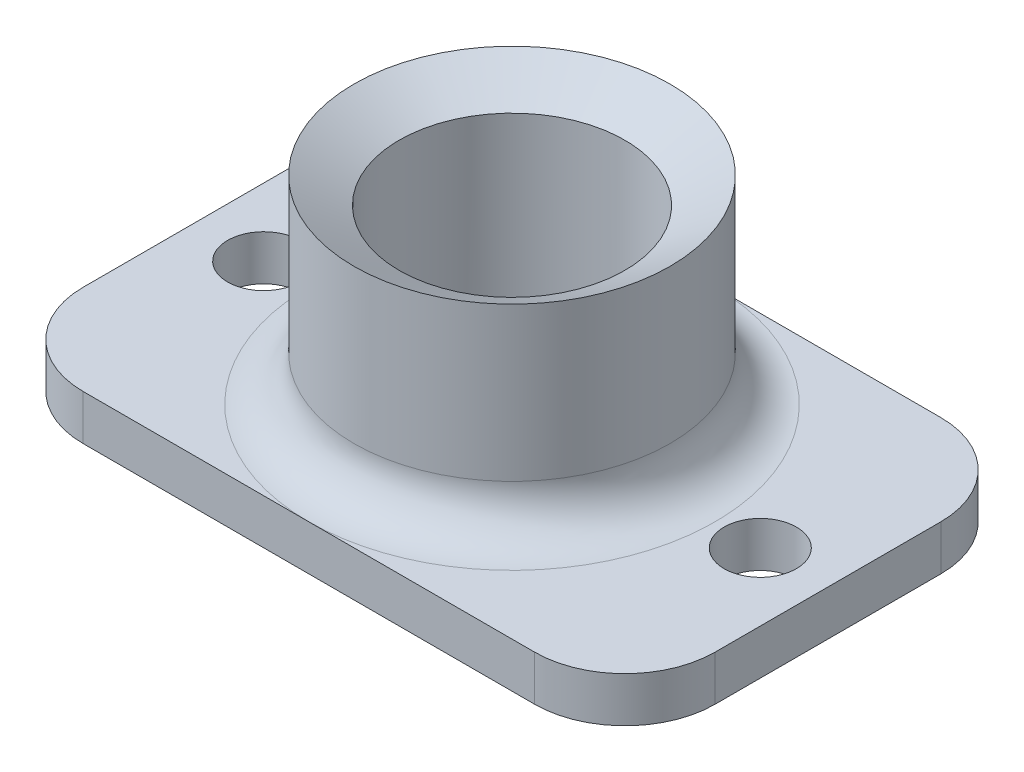
ISO-10303-21;
HEADER;
FILE_DESCRIPTION(('STEP AP214'),'2;1');
FILE_NAME('part.step','',(''),(''),'','','');
FILE_SCHEMA(('AUTOMOTIVE_DESIGN { 1 0 10303 214 1 1 1 1 }'));
ENDSEC;
DATA;
#1=APPLICATION_CONTEXT('core data for automotive mechanical design processes');
#2=APPLICATION_PROTOCOL_DEFINITION('international standard','automotive_design',2000,#1);
#3=PRODUCT_CONTEXT('',#1,'mechanical');
#4=PRODUCT('Part','Part','',(#3));
#5=PRODUCT_RELATED_PRODUCT_CATEGORY('part','',(#4));
#6=PRODUCT_DEFINITION_FORMATION('','',#4);
#7=PRODUCT_DEFINITION_CONTEXT('part definition',#1,'design');
#8=PRODUCT_DEFINITION('design','',#6,#7);
#9=PRODUCT_DEFINITION_SHAPE('','',#8);
#10=(LENGTH_UNIT() NAMED_UNIT(*) SI_UNIT(.MILLI.,.METRE.));
#11=(NAMED_UNIT(*) PLANE_ANGLE_UNIT() SI_UNIT($,.RADIAN.));
#12=(NAMED_UNIT(*) SI_UNIT($,.STERADIAN.) SOLID_ANGLE_UNIT());
#13=UNCERTAINTY_MEASURE_WITH_UNIT(LENGTH_MEASURE(1.E-05),#10,'distance_accuracy_value','');
#14=(GEOMETRIC_REPRESENTATION_CONTEXT(3) GLOBAL_UNCERTAINTY_ASSIGNED_CONTEXT((#13)) GLOBAL_UNIT_ASSIGNED_CONTEXT((#10,
#11,#12)) REPRESENTATION_CONTEXT('',''));
#15=CARTESIAN_POINT('',(0.,0.,0.));
#16=DIRECTION('',(0.,0.,1.));
#17=DIRECTION('',(1.,0.,0.));
#18=AXIS2_PLACEMENT_3D('',#15,#16,#17);
#19=CARTESIAN_POINT('',(0.,0.,0.));
#20=DIRECTION('',(0.,1.,0.));
#21=DIRECTION('',(0.,0.,1.));
#22=AXIS2_PLACEMENT_3D('',#19,#20,#21);
#23=CYLINDRICAL_SURFACE('',#22,12.5);
#24=CARTESIAN_POINT('',(0.,24.1132486540519,0.));
#25=DIRECTION('',(0.,1.,0.));
#26=DIRECTION('',(0.,0.,1.));
#27=AXIS2_PLACEMENT_3D('',#24,#25,#26);
#28=CIRCLE('',#27,12.5);
#29=CARTESIAN_POINT('',(0.,24.1132486540519,12.5));
#30=VERTEX_POINT('',#29);
#31=EDGE_CURVE('E11',#30,#30,#28,.T.);
#32=ORIENTED_EDGE('',*,*,#31,.T.);
#33=EDGE_LOOP('',(#32));
#34=FACE_BOUND('',#33,.T.);
#35=CARTESIAN_POINT('',(0.,2.,0.));
#36=DIRECTION('',(0.,-1.,0.));
#37=DIRECTION('',(0.,0.,-1.));
#38=AXIS2_PLACEMENT_3D('',#35,#36,#37);
#39=CIRCLE('',#38,12.5);
#40=CARTESIAN_POINT('',(0.,2.,-12.5));
#41=VERTEX_POINT('',#40);
#42=EDGE_CURVE('E48',#41,#41,#39,.F.);
#43=ORIENTED_EDGE('',*,*,#42,.F.);
#44=EDGE_LOOP('',(#43));
#45=FACE_BOUND('',#44,.T.);
#46=ADVANCED_FACE('F43',(#34,#45),#23,.F.);
#47=CARTESIAN_POINT('',(0.,5.,0.));
#48=DIRECTION('',(0.,-1.,0.));
#49=DIRECTION('',(0.,0.,-1.));
#50=AXIS2_PLACEMENT_3D('',#47,#48,#49);
#51=PLANE('',#50);
#52=CARTESIAN_POINT('',(-27.5,5.,0.));
#53=DIRECTION('',(0.,1.,0.));
#54=DIRECTION('',(0.,0.,1.));
#55=AXIS2_PLACEMENT_3D('',#52,#53,#54);
#56=CIRCLE('',#55,4.);
#57=CARTESIAN_POINT('',(-27.5,5.,4.));
#58=VERTEX_POINT('',#57);
#59=EDGE_CURVE('E256',#58,#58,#56,.T.);
#60=ORIENTED_EDGE('',*,*,#59,.F.);
#61=EDGE_LOOP('',(#60));
#62=FACE_BOUND('',#61,.T.);
#63=DIRECTION('',(1.,0.,0.));
#64=VECTOR('',#63,1.);
#65=CARTESIAN_POINT('',(-35.,5.,22.5));
#66=LINE('',#65,#64);
#67=CARTESIAN_POINT('',(-25.,5.,22.5));
#68=VERTEX_POINT('',#67);
#69=CARTESIAN_POINT('',(0.,5.,22.5));
#70=VERTEX_POINT('',#69);
#71=EDGE_CURVE('E138',#68,#70,#66,.T.);
#72=ORIENTED_EDGE('',*,*,#71,.T.);
#73=CARTESIAN_POINT('',(0.,5.,0.));
#74=DIRECTION('',(0.,-1.,0.));
#75=DIRECTION('',(0.,0.,-1.));
#76=AXIS2_PLACEMENT_3D('',#73,#74,#75);
#77=CIRCLE('',#76,22.5);
#78=CARTESIAN_POINT('',(0.,5.,-22.5));
#79=VERTEX_POINT('',#78);
#80=EDGE_CURVE('E54',#70,#79,#77,.T.);
#81=ORIENTED_EDGE('',*,*,#80,.T.);
#82=DIRECTION('',(-1.,0.,0.));
#83=VECTOR('',#82,1.);
#84=CARTESIAN_POINT('',(-35.,5.,-22.5));
#85=LINE('',#84,#83);
#86=CARTESIAN_POINT('',(-25.,5.,-22.5));
#87=VERTEX_POINT('',#86);
#88=EDGE_CURVE('E218',#79,#87,#85,.T.);
#89=ORIENTED_EDGE('',*,*,#88,.T.);
#90=CARTESIAN_POINT('',(-25.,5.,-12.5));
#91=DIRECTION('',(0.,-1.,0.));
#92=DIRECTION('',(0.,0.,-1.));
#93=AXIS2_PLACEMENT_3D('',#90,#91,#92);
#94=CIRCLE('',#93,10.);
#95=CARTESIAN_POINT('',(-35.,5.,-12.5));
#96=VERTEX_POINT('',#95);
#97=EDGE_CURVE('E190',#87,#96,#94,.F.);
#98=ORIENTED_EDGE('',*,*,#97,.T.);
#99=DIRECTION('',(0.,0.,1.));
#100=VECTOR('',#99,1.);
#101=CARTESIAN_POINT('',(-35.,5.,22.5));
#102=LINE('',#101,#100);
#103=CARTESIAN_POINT('',(-35.,5.,12.5));
#104=VERTEX_POINT('',#103);
#105=EDGE_CURVE('E232',#96,#104,#102,.T.);
#106=ORIENTED_EDGE('',*,*,#105,.T.);
#107=CARTESIAN_POINT('',(-25.,5.,12.5));
#108=DIRECTION('',(0.,-1.,0.));
#109=DIRECTION('',(0.,0.,-1.));
#110=AXIS2_PLACEMENT_3D('',#107,#108,#109);
#111=CIRCLE('',#110,10.);
#112=EDGE_CURVE('E187',#104,#68,#111,.F.);
#113=ORIENTED_EDGE('',*,*,#112,.T.);
#114=EDGE_LOOP('',(#72,#81,#89,#98,#106,#113));
#115=FACE_BOUND('',#114,.T.);
#116=ADVANCED_FACE('F217',(#62,#115),#51,.F.);
#117=CARTESIAN_POINT('',(35.,5.,22.5));
#118=DIRECTION('',(-1.,0.,0.));
#119=DIRECTION('',(0.,0.,1.));
#120=AXIS2_PLACEMENT_3D('',#117,#118,#119);
#121=PLANE('',#120);
#122=DIRECTION('',(0.,0.,-1.));
#123=VECTOR('',#122,1.);
#124=CARTESIAN_POINT('',(35.,0.,22.5));
#125=LINE('',#124,#123);
#126=CARTESIAN_POINT('',(35.,0.,12.5));
#127=VERTEX_POINT('',#126);
#128=CARTESIAN_POINT('',(35.,0.,-12.5));
#129=VERTEX_POINT('',#128);
#130=EDGE_CURVE('E133',#127,#129,#125,.T.);
#131=ORIENTED_EDGE('',*,*,#130,.T.);
#132=DIRECTION('',(0.,-1.,0.));
#133=VECTOR('',#132,1.);
#134=CARTESIAN_POINT('',(35.,5.,-12.5));
#135=LINE('',#134,#133);
#136=CARTESIAN_POINT('',(35.,5.,-12.5));
#137=VERTEX_POINT('',#136);
#138=EDGE_CURVE('E184',#129,#137,#135,.F.);
#139=ORIENTED_EDGE('',*,*,#138,.T.);
#140=DIRECTION('',(0.,0.,-1.));
#141=VECTOR('',#140,1.);
#142=CARTESIAN_POINT('',(35.,5.,22.5));
#143=LINE('',#142,#141);
#144=CARTESIAN_POINT('',(35.,5.,12.5));
#145=VERTEX_POINT('',#144);
#146=EDGE_CURVE('E136',#145,#137,#143,.T.);
#147=ORIENTED_EDGE('',*,*,#146,.F.);
#148=DIRECTION('',(0.,-1.,0.));
#149=VECTOR('',#148,1.);
#150=CARTESIAN_POINT('',(35.,5.,12.5));
#151=LINE('',#150,#149);
#152=EDGE_CURVE('E121',#145,#127,#151,.T.);
#153=ORIENTED_EDGE('',*,*,#152,.T.);
#154=EDGE_LOOP('',(#131,#139,#147,#153));
#155=FACE_BOUND('',#154,.T.);
#156=ADVANCED_FACE('F132',(#155),#121,.F.);
#157=CARTESIAN_POINT('',(-35.,5.,-22.5));
#158=DIRECTION('',(0.,0.,1.));
#159=DIRECTION('',(1.,0.,0.));
#160=AXIS2_PLACEMENT_3D('',#157,#158,#159);
#161=PLANE('',#160);
#162=CARTESIAN_POINT('',(25.,5.,-22.5));
#163=VERTEX_POINT('',#162);
#164=EDGE_CURVE('E223',#163,#79,#85,.T.);
#165=ORIENTED_EDGE('',*,*,#164,.F.);
#166=DIRECTION('',(0.,-1.,0.));
#167=VECTOR('',#166,1.);
#168=CARTESIAN_POINT('',(25.,5.,-22.5));
#169=LINE('',#168,#167);
#170=CARTESIAN_POINT('',(25.,0.,-22.5));
#171=VERTEX_POINT('',#170);
#172=EDGE_CURVE('E172',#163,#171,#169,.T.);
#173=ORIENTED_EDGE('',*,*,#172,.T.);
#174=DIRECTION('',(-1.,0.,0.));
#175=VECTOR('',#174,1.);
#176=CARTESIAN_POINT('',(-35.,0.,-22.5));
#177=LINE('',#176,#175);
#178=CARTESIAN_POINT('',(-25.,0.,-22.5));
#179=VERTEX_POINT('',#178);
#180=EDGE_CURVE('E144',#171,#179,#177,.T.);
#181=ORIENTED_EDGE('',*,*,#180,.T.);
#182=DIRECTION('',(0.,-1.,0.));
#183=VECTOR('',#182,1.);
#184=CARTESIAN_POINT('',(-25.,5.,-22.5));
#185=LINE('',#184,#183);
#186=EDGE_CURVE('E168',#179,#87,#185,.F.);
#187=ORIENTED_EDGE('',*,*,#186,.T.);
#188=ORIENTED_EDGE('',*,*,#88,.F.);
#189=EDGE_LOOP('',(#165,#173,#181,#187,#188));
#190=FACE_BOUND('',#189,.T.);
#191=ADVANCED_FACE('F222',(#190),#161,.F.);
#192=CARTESIAN_POINT('',(-35.,5.,22.5));
#193=DIRECTION('',(1.,0.,0.));
#194=DIRECTION('',(0.,0.,-1.));
#195=AXIS2_PLACEMENT_3D('',#192,#193,#194);
#196=PLANE('',#195);
#197=ORIENTED_EDGE('',*,*,#105,.F.);
#198=DIRECTION('',(0.,-1.,0.));
#199=VECTOR('',#198,1.);
#200=CARTESIAN_POINT('',(-35.,5.,-12.5));
#201=LINE('',#200,#199);
#202=CARTESIAN_POINT('',(-35.,0.,-12.5));
#203=VERTEX_POINT('',#202);
#204=EDGE_CURVE('E199',#96,#203,#201,.T.);
#205=ORIENTED_EDGE('',*,*,#204,.T.);
#206=DIRECTION('',(0.,0.,1.));
#207=VECTOR('',#206,1.);
#208=CARTESIAN_POINT('',(-35.,0.,22.5));
#209=LINE('',#208,#207);
#210=CARTESIAN_POINT('',(-35.,0.,12.5));
#211=VERTEX_POINT('',#210);
#212=EDGE_CURVE('E150',#203,#211,#209,.T.);
#213=ORIENTED_EDGE('',*,*,#212,.T.);
#214=DIRECTION('',(0.,-1.,0.));
#215=VECTOR('',#214,1.);
#216=CARTESIAN_POINT('',(-35.,5.,12.5));
#217=LINE('',#216,#215);
#218=EDGE_CURVE('E196',#211,#104,#217,.F.);
#219=ORIENTED_EDGE('',*,*,#218,.T.);
#220=EDGE_LOOP('',(#197,#205,#213,#219));
#221=FACE_BOUND('',#220,.T.);
#222=ADVANCED_FACE('F291',(#221),#196,.F.);
#223=CARTESIAN_POINT('',(-35.,5.,22.5));
#224=DIRECTION('',(0.,0.,-1.));
#225=DIRECTION('',(-1.,0.,0.));
#226=AXIS2_PLACEMENT_3D('',#223,#224,#225);
#227=PLANE('',#226);
#228=ORIENTED_EDGE('',*,*,#71,.F.);
#229=DIRECTION('',(0.,-1.,0.));
#230=VECTOR('',#229,1.);
#231=CARTESIAN_POINT('',(-25.,5.,22.5));
#232=LINE('',#231,#230);
#233=CARTESIAN_POINT('',(-25.,0.,22.5));
#234=VERTEX_POINT('',#233);
#235=EDGE_CURVE('E203',#68,#234,#232,.T.);
#236=ORIENTED_EDGE('',*,*,#235,.T.);
#237=DIRECTION('',(1.,0.,0.));
#238=VECTOR('',#237,1.);
#239=CARTESIAN_POINT('',(-35.,0.,22.5));
#240=LINE('',#239,#238);
#241=CARTESIAN_POINT('',(25.,0.,22.5));
#242=VERTEX_POINT('',#241);
#243=EDGE_CURVE('E160',#234,#242,#240,.T.);
#244=ORIENTED_EDGE('',*,*,#243,.T.);
#245=DIRECTION('',(0.,-1.,0.));
#246=VECTOR('',#245,1.);
#247=CARTESIAN_POINT('',(25.,5.,22.5));
#248=LINE('',#247,#246);
#249=CARTESIAN_POINT('',(25.,5.,22.5));
#250=VERTEX_POINT('',#249);
#251=EDGE_CURVE('E123',#242,#250,#248,.F.);
#252=ORIENTED_EDGE('',*,*,#251,.T.);
#253=EDGE_CURVE('E235',#70,#250,#66,.T.);
#254=ORIENTED_EDGE('',*,*,#253,.F.);
#255=EDGE_LOOP('',(#228,#236,#244,#252,#254));
#256=FACE_BOUND('',#255,.T.);
#257=ADVANCED_FACE('F285',(#256),#227,.F.);
#258=CARTESIAN_POINT('',(27.5,5.,0.));
#259=DIRECTION('',(0.,1.,0.));
#260=DIRECTION('',(0.,0.,1.));
#261=AXIS2_PLACEMENT_3D('',#258,#259,#260);
#262=CIRCLE('',#261,4.);
#263=CARTESIAN_POINT('',(27.5,5.,3.99999999999999));
#264=VERTEX_POINT('',#263);
#265=EDGE_CURVE('E248',#264,#264,#262,.T.);
#266=ORIENTED_EDGE('',*,*,#265,.F.);
#267=EDGE_LOOP('',(#266));
#268=FACE_BOUND('',#267,.T.);
#269=ORIENTED_EDGE('',*,*,#164,.T.);
#270=CARTESIAN_POINT('',(0.,5.,0.));
#271=DIRECTION('',(0.,-1.,0.));
#272=DIRECTION('',(0.,0.,-1.));
#273=AXIS2_PLACEMENT_3D('',#270,#271,#272);
#274=CIRCLE('',#273,22.5);
#275=EDGE_CURVE('E61',#79,#70,#274,.T.);
#276=ORIENTED_EDGE('',*,*,#275,.T.);
#277=ORIENTED_EDGE('',*,*,#253,.T.);
#278=CARTESIAN_POINT('',(25.,5.,12.5));
#279=DIRECTION('',(0.,-1.,0.));
#280=DIRECTION('',(0.,0.,-1.));
#281=AXIS2_PLACEMENT_3D('',#278,#279,#280);
#282=CIRCLE('',#281,10.);
#283=EDGE_CURVE('E165',#250,#145,#282,.F.);
#284=ORIENTED_EDGE('',*,*,#283,.T.);
#285=ORIENTED_EDGE('',*,*,#146,.T.);
#286=CARTESIAN_POINT('',(25.,5.,-12.5));
#287=DIRECTION('',(0.,-1.,0.));
#288=DIRECTION('',(0.,0.,-1.));
#289=AXIS2_PLACEMENT_3D('',#286,#287,#288);
#290=CIRCLE('',#289,10.);
#291=EDGE_CURVE('E193',#137,#163,#290,.F.);
#292=ORIENTED_EDGE('',*,*,#291,.T.);
#293=EDGE_LOOP('',(#269,#276,#277,#284,#285,#292));
#294=FACE_BOUND('',#293,.T.);
#295=ADVANCED_FACE('F229',(#268,#294),#51,.F.);
#296=CARTESIAN_POINT('',(0.,0.,0.));
#297=DIRECTION('',(0.,-1.,0.));
#298=DIRECTION('',(0.,0.,-1.));
#299=AXIS2_PLACEMENT_3D('',#296,#297,#298);
#300=PLANE('',#299);
#301=CARTESIAN_POINT('',(-27.5,0.,0.));
#302=DIRECTION('',(0.,1.,0.));
#303=DIRECTION('',(0.,0.,1.));
#304=AXIS2_PLACEMENT_3D('',#301,#302,#303);
#305=CIRCLE('',#304,4.);
#306=CARTESIAN_POINT('',(-27.5,0.,4.));
#307=VERTEX_POINT('',#306);
#308=EDGE_CURVE('E244',#307,#307,#305,.T.);
#309=ORIENTED_EDGE('',*,*,#308,.T.);
#310=EDGE_LOOP('',(#309));
#311=FACE_BOUND('',#310,.T.);
#312=CARTESIAN_POINT('',(27.5,0.,0.));
#313=DIRECTION('',(0.,1.,0.));
#314=DIRECTION('',(0.,0.,1.));
#315=AXIS2_PLACEMENT_3D('',#312,#313,#314);
#316=CIRCLE('',#315,4.);
#317=CARTESIAN_POINT('',(27.5,0.,3.99999999999999));
#318=VERTEX_POINT('',#317);
#319=EDGE_CURVE('E252',#318,#318,#316,.T.);
#320=ORIENTED_EDGE('',*,*,#319,.T.);
#321=EDGE_LOOP('',(#320));
#322=FACE_BOUND('',#321,.T.);
#323=CARTESIAN_POINT('',(0.,0.,0.));
#324=DIRECTION('',(0.,-1.,0.));
#325=DIRECTION('',(0.,0.,-1.));
#326=AXIS2_PLACEMENT_3D('',#323,#324,#325);
#327=CIRCLE('',#326,14.6);
#328=CARTESIAN_POINT('',(0.,0.,-14.6));
#329=VERTEX_POINT('',#328);
#330=EDGE_CURVE('E239',#329,#329,#327,.T.);
#331=ORIENTED_EDGE('',*,*,#330,.F.);
#332=EDGE_LOOP('',(#331));
#333=FACE_BOUND('',#332,.T.);
#334=ORIENTED_EDGE('',*,*,#180,.F.);
#335=CARTESIAN_POINT('',(25.,0.,-12.5));
#336=DIRECTION('',(0.,-1.,0.));
#337=DIRECTION('',(0.,0.,-1.));
#338=AXIS2_PLACEMENT_3D('',#335,#336,#337);
#339=CIRCLE('',#338,10.);
#340=EDGE_CURVE('E142',#171,#129,#339,.T.);
#341=ORIENTED_EDGE('',*,*,#340,.T.);
#342=ORIENTED_EDGE('',*,*,#130,.F.);
#343=CARTESIAN_POINT('',(25.,0.,12.5));
#344=DIRECTION('',(0.,-1.,0.));
#345=DIRECTION('',(0.,0.,-1.));
#346=AXIS2_PLACEMENT_3D('',#343,#344,#345);
#347=CIRCLE('',#346,10.);
#348=EDGE_CURVE('E117',#127,#242,#347,.T.);
#349=ORIENTED_EDGE('',*,*,#348,.T.);
#350=ORIENTED_EDGE('',*,*,#243,.F.);
#351=CARTESIAN_POINT('',(-25.,0.,12.5));
#352=DIRECTION('',(0.,-1.,0.));
#353=DIRECTION('',(0.,0.,-1.));
#354=AXIS2_PLACEMENT_3D('',#351,#352,#353);
#355=CIRCLE('',#354,10.);
#356=EDGE_CURVE('E176',#234,#211,#355,.T.);
#357=ORIENTED_EDGE('',*,*,#356,.T.);
#358=ORIENTED_EDGE('',*,*,#212,.F.);
#359=CARTESIAN_POINT('',(-25.,0.,-12.5));
#360=DIRECTION('',(0.,-1.,0.));
#361=DIRECTION('',(0.,0.,-1.));
#362=AXIS2_PLACEMENT_3D('',#359,#360,#361);
#363=CIRCLE('',#362,10.);
#364=EDGE_CURVE('E179',#203,#179,#363,.T.);
#365=ORIENTED_EDGE('',*,*,#364,.T.);
#366=EDGE_LOOP('',(#334,#341,#342,#349,#350,#357,#358,#365));
#367=FACE_BOUND('',#366,.T.);
#368=ADVANCED_FACE('F141',(#311,#322,#333,#367),#300,.T.);
#369=CARTESIAN_POINT('',(25.,5.,12.5));
#370=DIRECTION('',(0.,-1.,0.));
#371=DIRECTION('',(0.,0.,-1.));
#372=AXIS2_PLACEMENT_3D('',#369,#370,#371);
#373=CYLINDRICAL_SURFACE('',#372,10.);
#374=ORIENTED_EDGE('',*,*,#283,.F.);
#375=ORIENTED_EDGE('',*,*,#251,.F.);
#376=ORIENTED_EDGE('',*,*,#348,.F.);
#377=ORIENTED_EDGE('',*,*,#152,.F.);
#378=EDGE_LOOP('',(#374,#375,#376,#377));
#379=FACE_BOUND('',#378,.T.);
#380=ADVANCED_FACE('F120',(#379),#373,.T.);
#381=CARTESIAN_POINT('',(25.,5.,-12.5));
#382=DIRECTION('',(0.,-1.,0.));
#383=DIRECTION('',(0.,0.,-1.));
#384=AXIS2_PLACEMENT_3D('',#381,#382,#383);
#385=CYLINDRICAL_SURFACE('',#384,10.);
#386=ORIENTED_EDGE('',*,*,#291,.F.);
#387=ORIENTED_EDGE('',*,*,#138,.F.);
#388=ORIENTED_EDGE('',*,*,#340,.F.);
#389=ORIENTED_EDGE('',*,*,#172,.F.);
#390=EDGE_LOOP('',(#386,#387,#388,#389));
#391=FACE_BOUND('',#390,.T.);
#392=ADVANCED_FACE('F383',(#391),#385,.T.);
#393=CARTESIAN_POINT('',(-25.,5.,-12.5));
#394=DIRECTION('',(0.,-1.,0.));
#395=DIRECTION('',(0.,0.,-1.));
#396=AXIS2_PLACEMENT_3D('',#393,#394,#395);
#397=CYLINDRICAL_SURFACE('',#396,10.);
#398=ORIENTED_EDGE('',*,*,#97,.F.);
#399=ORIENTED_EDGE('',*,*,#186,.F.);
#400=ORIENTED_EDGE('',*,*,#364,.F.);
#401=ORIENTED_EDGE('',*,*,#204,.F.);
#402=EDGE_LOOP('',(#398,#399,#400,#401));
#403=FACE_BOUND('',#402,.T.);
#404=ADVANCED_FACE('F319',(#403),#397,.T.);
#405=CARTESIAN_POINT('',(-25.,5.,12.5));
#406=DIRECTION('',(0.,-1.,0.));
#407=DIRECTION('',(0.,0.,-1.));
#408=AXIS2_PLACEMENT_3D('',#405,#406,#407);
#409=CYLINDRICAL_SURFACE('',#408,10.);
#410=ORIENTED_EDGE('',*,*,#112,.F.);
#411=ORIENTED_EDGE('',*,*,#218,.F.);
#412=ORIENTED_EDGE('',*,*,#356,.F.);
#413=ORIENTED_EDGE('',*,*,#235,.F.);
#414=EDGE_LOOP('',(#410,#411,#412,#413));
#415=FACE_BOUND('',#414,.T.);
#416=ADVANCED_FACE('F313',(#415),#409,.T.);
#417=CARTESIAN_POINT('',(0.,27.,0.));
#418=DIRECTION('',(0.,-1.,0.));
#419=DIRECTION('',(0.,0.,-1.));
#420=AXIS2_PLACEMENT_3D('',#417,#418,#419);
#421=CYLINDRICAL_SURFACE('',#420,17.5);
#422=CARTESIAN_POINT('',(0.,10.,0.));
#423=DIRECTION('',(0.,-1.,0.));
#424=DIRECTION('',(0.,0.,-1.));
#425=AXIS2_PLACEMENT_3D('',#422,#423,#424);
#426=CIRCLE('',#425,17.5);
#427=CARTESIAN_POINT('',(0.,10.,-17.5));
#428=VERTEX_POINT('',#427);
#429=EDGE_CURVE('E207',#428,#428,#426,.F.);
#430=ORIENTED_EDGE('',*,*,#429,.T.);
#431=EDGE_LOOP('',(#430));
#432=FACE_BOUND('',#431,.T.);
#433=CARTESIAN_POINT('',(0.,27.,0.));
#434=DIRECTION('',(0.,1.,0.));
#435=DIRECTION('',(0.,0.,1.));
#436=AXIS2_PLACEMENT_3D('',#433,#434,#435);
#437=CIRCLE('',#436,17.5);
#438=CARTESIAN_POINT('',(0.,27.,17.5));
#439=VERTEX_POINT('',#438);
#440=EDGE_CURVE('E145',#439,#439,#437,.T.);
#441=ORIENTED_EDGE('',*,*,#440,.F.);
#442=EDGE_LOOP('',(#441));
#443=FACE_BOUND('',#442,.T.);
#444=ADVANCED_FACE('F310',(#432,#443),#421,.T.);
#445=CARTESIAN_POINT('',(0.,10.,0.));
#446=DIRECTION('',(0.,-1.,0.));
#447=DIRECTION('',(0.,0.,-1.));
#448=AXIS2_PLACEMENT_3D('',#445,#446,#447);
#449=TOROIDAL_SURFACE('',#448,22.5,5.);
#450=ORIENTED_EDGE('',*,*,#275,.F.);
#451=ORIENTED_EDGE('',*,*,#80,.F.);
#452=EDGE_LOOP('',(#450,#451));
#453=FACE_BOUND('',#452,.T.);
#454=ORIENTED_EDGE('',*,*,#429,.F.);
#455=EDGE_LOOP('',(#454));
#456=FACE_BOUND('',#455,.T.);
#457=ADVANCED_FACE('F312',(#453,#456),#449,.F.);
#458=CARTESIAN_POINT('',(0.,24.1132486540519,0.));
#459=DIRECTION('',(0.,1.,0.));
#460=DIRECTION('',(0.,0.,1.));
#461=AXIS2_PLACEMENT_3D('',#458,#459,#460);
#462=CONICAL_SURFACE('',#461,12.5,1.0471975511966);
#463=ORIENTED_EDGE('',*,*,#440,.T.);
#464=EDGE_LOOP('',(#463));
#465=FACE_BOUND('',#464,.T.);
#466=ORIENTED_EDGE('',*,*,#31,.F.);
#467=EDGE_LOOP('',(#466));
#468=FACE_BOUND('',#467,.T.);
#469=ADVANCED_FACE('F46',(#465,#468),#462,.F.);
#470=CARTESIAN_POINT('',(0.,2.,0.));
#471=DIRECTION('',(0.,-1.,0.));
#472=DIRECTION('',(0.,0.,-1.));
#473=AXIS2_PLACEMENT_3D('',#470,#471,#472);
#474=PLANE('',#473);
#475=CARTESIAN_POINT('',(0.,2.,0.));
#476=DIRECTION('',(0.,-1.,0.));
#477=DIRECTION('',(0.,0.,-1.));
#478=AXIS2_PLACEMENT_3D('',#475,#476,#477);
#479=CIRCLE('',#478,14.6);
#480=CARTESIAN_POINT('',(0.,2.,-14.6));
#481=VERTEX_POINT('',#480);
#482=EDGE_CURVE('E243',#481,#481,#479,.T.);
#483=ORIENTED_EDGE('',*,*,#482,.T.);
#484=EDGE_LOOP('',(#483));
#485=FACE_BOUND('',#484,.T.);
#486=ORIENTED_EDGE('',*,*,#42,.T.);
#487=EDGE_LOOP('',(#486));
#488=FACE_BOUND('',#487,.T.);
#489=ADVANCED_FACE('F303',(#485,#488),#474,.T.);
#490=CARTESIAN_POINT('',(0.,2.,0.));
#491=DIRECTION('',(0.,-1.,0.));
#492=DIRECTION('',(0.,0.,-1.));
#493=AXIS2_PLACEMENT_3D('',#490,#491,#492);
#494=CYLINDRICAL_SURFACE('',#493,14.6);
#495=ORIENTED_EDGE('',*,*,#482,.F.);
#496=EDGE_LOOP('',(#495));
#497=FACE_BOUND('',#496,.T.);
#498=ORIENTED_EDGE('',*,*,#330,.T.);
#499=EDGE_LOOP('',(#498));
#500=FACE_BOUND('',#499,.T.);
#501=ADVANCED_FACE('F297',(#497,#500),#494,.F.);
#502=CARTESIAN_POINT('',(27.5,0.,0.));
#503=DIRECTION('',(0.,1.,0.));
#504=DIRECTION('',(0.,0.,1.));
#505=AXIS2_PLACEMENT_3D('',#502,#503,#504);
#506=CYLINDRICAL_SURFACE('',#505,4.);
#507=ORIENTED_EDGE('',*,*,#319,.F.);
#508=EDGE_LOOP('',(#507));
#509=FACE_BOUND('',#508,.T.);
#510=ORIENTED_EDGE('',*,*,#265,.T.);
#511=EDGE_LOOP('',(#510));
#512=FACE_BOUND('',#511,.T.);
#513=ADVANCED_FACE('F269',(#509,#512),#506,.F.);
#514=CARTESIAN_POINT('',(-27.5,0.,0.));
#515=DIRECTION('',(0.,1.,0.));
#516=DIRECTION('',(0.,0.,1.));
#517=AXIS2_PLACEMENT_3D('',#514,#515,#516);
#518=CYLINDRICAL_SURFACE('',#517,4.);
#519=ORIENTED_EDGE('',*,*,#308,.F.);
#520=EDGE_LOOP('',(#519));
#521=FACE_BOUND('',#520,.T.);
#522=ORIENTED_EDGE('',*,*,#59,.T.);
#523=EDGE_LOOP('',(#522));
#524=FACE_BOUND('',#523,.T.);
#525=ADVANCED_FACE('F266',(#521,#524),#518,.F.);
#526=CLOSED_SHELL('',(#46,#116,#156,#191,#222,#257,#295,#368,#380,#392,#404,#416,#444,#457,#469,
#489,#501,#513,#525));
#527=MANIFOLD_SOLID_BREP('B2',#526);
#528=ADVANCED_BREP_SHAPE_REPRESENTATION('',(#18,#527),#14);
#529=SHAPE_DEFINITION_REPRESENTATION(#9,#528);
ENDSEC;
END-ISO-10303-21;
